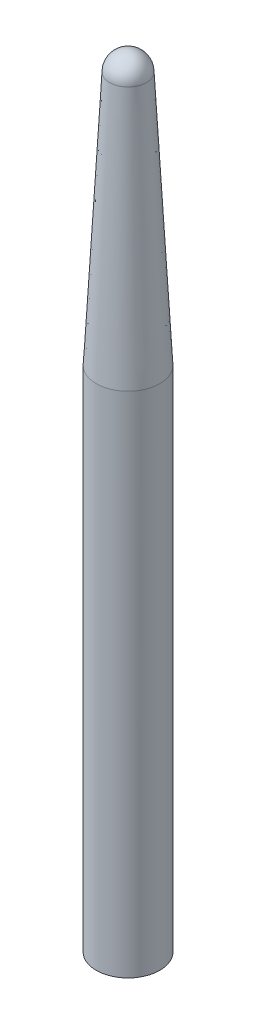
ISO-10303-21;
HEADER;
FILE_DESCRIPTION(('STEP AP214'),'2;1');
FILE_NAME('part.step','',(''),(''),'','','');
FILE_SCHEMA(('AUTOMOTIVE_DESIGN { 1 0 10303 214 1 1 1 1 }'));
ENDSEC;
DATA;
#1=APPLICATION_CONTEXT('core data for automotive mechanical design processes');
#2=APPLICATION_PROTOCOL_DEFINITION('international standard','automotive_design',2000,#1);
#3=PRODUCT_CONTEXT('',#1,'mechanical');
#4=PRODUCT('Part','Part','',(#3));
#5=PRODUCT_RELATED_PRODUCT_CATEGORY('part','',(#4));
#6=PRODUCT_DEFINITION_FORMATION('','',#4);
#7=PRODUCT_DEFINITION_CONTEXT('part definition',#1,'design');
#8=PRODUCT_DEFINITION('design','',#6,#7);
#9=PRODUCT_DEFINITION_SHAPE('','',#8);
#10=(LENGTH_UNIT() NAMED_UNIT(*) SI_UNIT(.MILLI.,.METRE.));
#11=(NAMED_UNIT(*) PLANE_ANGLE_UNIT() SI_UNIT($,.RADIAN.));
#12=(NAMED_UNIT(*) SI_UNIT($,.STERADIAN.) SOLID_ANGLE_UNIT());
#13=UNCERTAINTY_MEASURE_WITH_UNIT(LENGTH_MEASURE(1.E-05),#10,'distance_accuracy_value','');
#14=(GEOMETRIC_REPRESENTATION_CONTEXT(3) GLOBAL_UNCERTAINTY_ASSIGNED_CONTEXT((#13)) GLOBAL_UNIT_ASSIGNED_CONTEXT((#10,
#11,#12)) REPRESENTATION_CONTEXT('',''));
#15=CARTESIAN_POINT('',(0.,0.,0.));
#16=DIRECTION('',(0.,0.,1.));
#17=DIRECTION('',(1.,0.,0.));
#18=AXIS2_PLACEMENT_3D('',#15,#16,#17);
#19=CARTESIAN_POINT('',(0.,76.2,0.));
#20=DIRECTION('',(0.,-1.,0.));
#21=DIRECTION('',(0.,0.,-1.));
#22=AXIS2_PLACEMENT_3D('',#19,#20,#21);
#23=CYLINDRICAL_SURFACE('',#22,4.7625);
#24=CARTESIAN_POINT('',(0.,76.2,0.));
#25=DIRECTION('',(0.,1.,0.));
#26=DIRECTION('',(0.,0.,1.));
#27=AXIS2_PLACEMENT_3D('',#24,#25,#26);
#28=CIRCLE('',#27,4.7625);
#29=CARTESIAN_POINT('',(0.,76.2,-4.7625));
#30=VERTEX_POINT('',#29);
#31=EDGE_CURVE('E11',#30,#30,#28,.T.);
#32=CARTESIAN_POINT('',(0.,0.,0.));
#33=DIRECTION('',(0.,1.,0.));
#34=DIRECTION('',(0.,0.,1.));
#35=AXIS2_PLACEMENT_3D('',#32,#33,#34);
#36=CIRCLE('',#35,4.7625);
#37=CARTESIAN_POINT('',(0.,0.,-4.7625));
#38=VERTEX_POINT('',#37);
#39=EDGE_CURVE('E37',#38,#38,#36,.T.);
#40=CARTESIAN_POINT('',(0.,76.2,-4.7625));
#41=CARTESIAN_POINT('',(0.,75.40625,-4.7625));
#42=CARTESIAN_POINT('',(0.,74.6125,-4.7625));
#43=CARTESIAN_POINT('',(0.,73.025,-4.7625));
#44=CARTESIAN_POINT('',(0.,72.23125,-4.7625));
#45=CARTESIAN_POINT('',(0.,70.64375,-4.7625));
#46=CARTESIAN_POINT('',(0.,69.85,-4.7625));
#47=CARTESIAN_POINT('',(0.,68.2625,-4.7625));
#48=CARTESIAN_POINT('',(0.,67.46875,-4.7625));
#49=CARTESIAN_POINT('',(0.,65.88125,-4.7625));
#50=CARTESIAN_POINT('',(0.,65.0875,-4.7625));
#51=CARTESIAN_POINT('',(0.,63.5,-4.7625));
#52=CARTESIAN_POINT('',(0.,62.70625,-4.7625));
#53=CARTESIAN_POINT('',(0.,61.11875,-4.7625));
#54=CARTESIAN_POINT('',(0.,60.325,-4.7625));
#55=CARTESIAN_POINT('',(0.,58.7375,-4.7625));
#56=CARTESIAN_POINT('',(0.,57.94375,-4.7625));
#57=CARTESIAN_POINT('',(0.,56.35625,-4.7625));
#58=CARTESIAN_POINT('',(0.,55.5625,-4.7625));
#59=CARTESIAN_POINT('',(0.,53.975,-4.7625));
#60=CARTESIAN_POINT('',(0.,53.18125,-4.7625));
#61=CARTESIAN_POINT('',(0.,51.59375,-4.7625));
#62=CARTESIAN_POINT('',(0.,50.8,-4.7625));
#63=CARTESIAN_POINT('',(0.,49.2125,-4.7625));
#64=CARTESIAN_POINT('',(0.,48.41875,-4.7625));
#65=CARTESIAN_POINT('',(0.,46.83125,-4.7625));
#66=CARTESIAN_POINT('',(0.,46.0375,-4.7625));
#67=CARTESIAN_POINT('',(0.,44.45,-4.7625));
#68=CARTESIAN_POINT('',(0.,43.65625,-4.7625));
#69=CARTESIAN_POINT('',(0.,42.06875,-4.7625));
#70=CARTESIAN_POINT('',(0.,41.275,-4.7625));
#71=CARTESIAN_POINT('',(0.,39.6875,-4.7625));
#72=CARTESIAN_POINT('',(0.,38.89375,-4.7625));
#73=CARTESIAN_POINT('',(0.,37.30625,-4.7625));
#74=CARTESIAN_POINT('',(0.,36.5125,-4.7625));
#75=CARTESIAN_POINT('',(0.,34.925,-4.7625));
#76=CARTESIAN_POINT('',(0.,34.13125,-4.7625));
#77=CARTESIAN_POINT('',(0.,32.54375,-4.7625));
#78=CARTESIAN_POINT('',(0.,31.75,-4.7625));
#79=CARTESIAN_POINT('',(0.,30.1625,-4.7625));
#80=CARTESIAN_POINT('',(0.,29.36875,-4.7625));
#81=CARTESIAN_POINT('',(0.,27.78125,-4.7625));
#82=CARTESIAN_POINT('',(0.,26.9875,-4.7625));
#83=CARTESIAN_POINT('',(0.,25.4,-4.7625));
#84=CARTESIAN_POINT('',(0.,24.60625,-4.7625));
#85=CARTESIAN_POINT('',(0.,23.01875,-4.7625));
#86=CARTESIAN_POINT('',(0.,22.225,-4.7625));
#87=CARTESIAN_POINT('',(0.,20.6375,-4.7625));
#88=CARTESIAN_POINT('',(0.,19.84375,-4.7625));
#89=CARTESIAN_POINT('',(0.,18.25625,-4.7625));
#90=CARTESIAN_POINT('',(0.,17.4625,-4.7625));
#91=CARTESIAN_POINT('',(0.,15.875,-4.7625));
#92=CARTESIAN_POINT('',(0.,15.08125,-4.7625));
#93=CARTESIAN_POINT('',(0.,13.49375,-4.7625));
#94=CARTESIAN_POINT('',(0.,12.7,-4.7625));
#95=CARTESIAN_POINT('',(0.,11.1125,-4.7625));
#96=CARTESIAN_POINT('',(0.,10.31875,-4.7625));
#97=CARTESIAN_POINT('',(0.,8.73125,-4.7625));
#98=CARTESIAN_POINT('',(0.,7.93750000000001,-4.7625));
#99=CARTESIAN_POINT('',(0.,6.35,-4.7625));
#100=CARTESIAN_POINT('',(0.,5.55625,-4.7625));
#101=CARTESIAN_POINT('',(0.,3.96875,-4.7625));
#102=CARTESIAN_POINT('',(0.,3.175,-4.7625));
#103=CARTESIAN_POINT('',(0.,1.5875,-4.7625));
#104=CARTESIAN_POINT('',(0.,0.793750000000001,-4.7625));
#105=CARTESIAN_POINT('',(0.,0.,-4.7625));
#106=B_SPLINE_CURVE_WITH_KNOTS('',3,(#40,#41,#42,#43,#44,#45,#46,#47,#48,#49,#50,#51,#52,#53,
#54,#55,#56,#57,#58,#59,#60,#61,#62,#63,#64,#65,#66,#67,#68,#69,#70,#71,#72,#73,#74,#75,#76,#77,
#78,#79,#80,#81,#82,#83,#84,#85,#86,#87,#88,#89,#90,#91,#92,#93,#94,#95,#96,#97,#98,#99,#100,
#101,#102,#103,#104,#105),.UNSPECIFIED.,.F.,.F.,(4,2,2,2,2,2,2,2,2,2,2,2,2,2,2,2,2,2,2,2,2,2,2,
2,2,2,2,2,2,2,2,2,4),(0.,2.38125,4.7625,7.14375,9.52500000000001,11.90625,14.2875,16.66875,
19.05,21.43125,23.8125,26.19375,28.575,30.95625,33.3375,35.71875,38.1,40.48125,42.8625,45.24375,
47.625,50.00625,52.3875,54.76875,57.15,59.53125,61.9125,64.29375,66.675,69.05625,71.4375,
73.81875,76.2),.UNSPECIFIED.);
#107=EDGE_CURVE('BSEAM34',#30,#38,#106,.T.);
#108=ORIENTED_EDGE('',*,*,#31,.F.);
#109=ORIENTED_EDGE('',*,*,#39,.T.);
#110=ORIENTED_EDGE('',*,*,#107,.T.);
#111=ORIENTED_EDGE('',*,*,#107,.F.);
#112=EDGE_LOOP('',(#108,#110,#109,#111));
#113=FACE_BOUND('',#112,.T.);
#114=ADVANCED_FACE('F34',(#113),#23,.T.);
#115=CARTESIAN_POINT('',(0.,0.,0.));
#116=DIRECTION('',(0.,1.,0.));
#117=DIRECTION('',(0.,0.,1.));
#118=AXIS2_PLACEMENT_3D('',#115,#116,#117);
#119=PLANE('',#118);
#120=CARTESIAN_POINT('',(0.,0.,0.));
#121=DIRECTION('',(0.,-1.,0.));
#122=DIRECTION('',(0.,0.,-1.));
#123=AXIS2_PLACEMENT_3D('',#120,#121,#122);
#124=CIRCLE('',#123,2.7051);
#125=CARTESIAN_POINT('',(0.,0.,-2.7051));
#126=VERTEX_POINT('',#125);
#127=EDGE_CURVE('E54',#126,#126,#124,.T.);
#128=ORIENTED_EDGE('',*,*,#127,.F.);
#129=EDGE_LOOP('',(#128));
#130=FACE_BOUND('',#129,.T.);
#131=ORIENTED_EDGE('',*,*,#39,.F.);
#132=EDGE_LOOP('',(#131));
#133=FACE_BOUND('',#132,.T.);
#134=ADVANCED_FACE('F63',(#130,#133),#119,.F.);
#135=CARTESIAN_POINT('',(0.,76.2,0.));
#136=DIRECTION('',(0.,-1.,0.));
#137=DIRECTION('',(0.,0.,1.));
#138=AXIS2_PLACEMENT_3D('',#135,#136,#137);
#139=CONICAL_SURFACE('',#138,4.7625,0.0523598775598299);
#140=CARTESIAN_POINT('',(0.,114.3,0.));
#141=DIRECTION('',(0.,1.,0.));
#142=DIRECTION('',(0.,0.,1.));
#143=AXIS2_PLACEMENT_3D('',#140,#141,#142);
#144=CIRCLE('',#143,2.76576360931613);
#145=CARTESIAN_POINT('',(0.,114.3,2.76576360931613));
#146=VERTEX_POINT('',#145);
#147=EDGE_CURVE('E53',#146,#146,#144,.T.);
#148=ORIENTED_EDGE('',*,*,#147,.F.);
#149=EDGE_LOOP('',(#148));
#150=FACE_BOUND('',#149,.T.);
#151=ORIENTED_EDGE('',*,*,#31,.T.);
#152=EDGE_LOOP('',(#151));
#153=FACE_BOUND('',#152,.T.);
#154=ADVANCED_FACE('F66',(#150,#153),#139,.T.);
#155=CARTESIAN_POINT('',(0.,114.3,0.));
#156=DIRECTION('',(0.,0.,-1.));
#157=DIRECTION('',(1.,0.,0.));
#158=AXIS2_PLACEMENT_3D('',#155,#156,#157);
#159=SPHERICAL_SURFACE('',#158,2.76576360931613);
#160=CARTESIAN_POINT('',(0.,114.3,0.));
#161=DIRECTION('',(0.,1.,0.));
#162=DIRECTION('',(0.,0.,1.));
#163=AXIS2_PLACEMENT_3D('',#160,#161,#162);
#164=SPHERICAL_SURFACE('',#163,2.76576360931613);
#165=ORIENTED_EDGE('',*,*,#147,.T.);
#166=EDGE_LOOP('',(#165));
#167=FACE_BOUND('',#166,.T.);
#168=ADVANCED_FACE('F47',(#167),#164,.T.);
#169=CARTESIAN_POINT('',(0.,7.874,0.));
#170=DIRECTION('',(0.,-1.,0.));
#171=DIRECTION('',(0.,0.,-1.));
#172=AXIS2_PLACEMENT_3D('',#169,#170,#171);
#173=CONICAL_SURFACE('',#172,2.7051,1.02974425867665);
#174=CARTESIAN_POINT('',(0.,9.49938806053145,0.));
#175=VERTEX_POINT('',#174);
#176=VERTEX_LOOP('',#175);
#177=FACE_BOUND('',#176,.T.);
#178=CARTESIAN_POINT('',(0.,7.874,0.));
#179=DIRECTION('',(0.,-1.,0.));
#180=DIRECTION('',(0.,0.,-1.));
#181=AXIS2_PLACEMENT_3D('',#178,#179,#180);
#182=CIRCLE('',#181,2.7051);
#183=CARTESIAN_POINT('',(0.,7.874,-2.7051));
#184=VERTEX_POINT('',#183);
#185=EDGE_CURVE('E51',#184,#184,#182,.T.);
#186=ORIENTED_EDGE('',*,*,#185,.T.);
#187=EDGE_LOOP('',(#186));
#188=FACE_BOUND('',#187,.T.);
#189=ADVANCED_FACE('F43',(#177,#188),#173,.F.);
#190=CARTESIAN_POINT('',(0.,0.,0.));
#191=DIRECTION('',(0.,-1.,0.));
#192=DIRECTION('',(0.,0.,-1.));
#193=AXIS2_PLACEMENT_3D('',#190,#191,#192);
#194=CYLINDRICAL_SURFACE('',#193,2.7051);
#195=ORIENTED_EDGE('',*,*,#185,.F.);
#196=EDGE_LOOP('',(#195));
#197=FACE_BOUND('',#196,.T.);
#198=ORIENTED_EDGE('',*,*,#127,.T.);
#199=EDGE_LOOP('',(#198));
#200=FACE_BOUND('',#199,.T.);
#201=ADVANCED_FACE('F46',(#197,#200),#194,.F.);
#202=CLOSED_SHELL('',(#114,#134,#154,#168,#189,#201));
#203=MANIFOLD_SOLID_BREP('B2',#202);
#204=ADVANCED_BREP_SHAPE_REPRESENTATION('',(#18,#203),#14);
#205=SHAPE_DEFINITION_REPRESENTATION(#9,#204);
ENDSEC;
END-ISO-10303-21;
